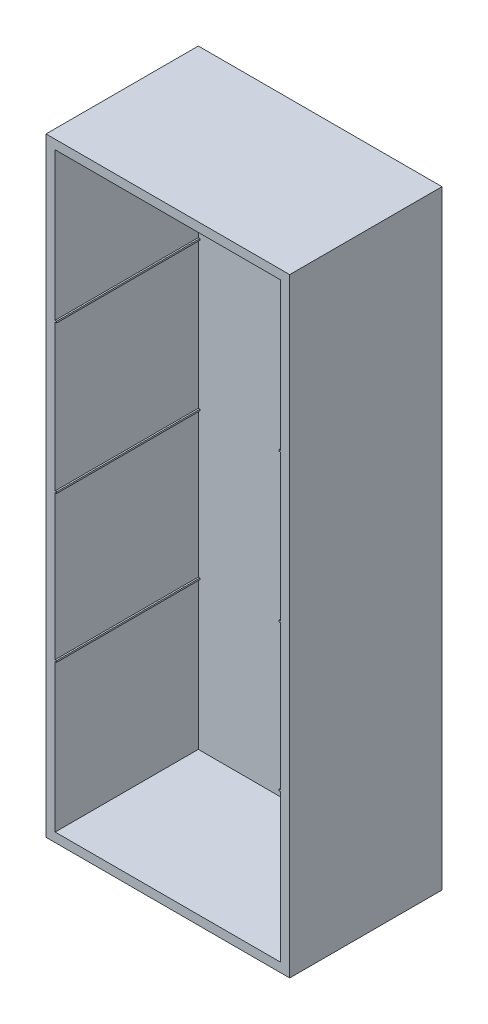
ISO-10303-21;
HEADER;
FILE_DESCRIPTION(('STEP AP214'),'2;1');
FILE_NAME('part.step','',(''),(''),'','','');
FILE_SCHEMA(('AUTOMOTIVE_DESIGN { 1 0 10303 214 1 1 1 1 }'));
ENDSEC;
DATA;
#1=APPLICATION_CONTEXT('core data for automotive mechanical design processes');
#2=APPLICATION_PROTOCOL_DEFINITION('international standard','automotive_design',2000,#1);
#3=PRODUCT_CONTEXT('',#1,'mechanical');
#4=PRODUCT('Part','Part','',(#3));
#5=PRODUCT_RELATED_PRODUCT_CATEGORY('part','',(#4));
#6=PRODUCT_DEFINITION_FORMATION('','',#4);
#7=PRODUCT_DEFINITION_CONTEXT('part definition',#1,'design');
#8=PRODUCT_DEFINITION('design','',#6,#7);
#9=PRODUCT_DEFINITION_SHAPE('','',#8);
#10=(LENGTH_UNIT() NAMED_UNIT(*) SI_UNIT(.MILLI.,.METRE.));
#11=(NAMED_UNIT(*) PLANE_ANGLE_UNIT() SI_UNIT($,.RADIAN.));
#12=(NAMED_UNIT(*) SI_UNIT($,.STERADIAN.) SOLID_ANGLE_UNIT());
#13=UNCERTAINTY_MEASURE_WITH_UNIT(LENGTH_MEASURE(1.E-05),#10,'distance_accuracy_value','');
#14=(GEOMETRIC_REPRESENTATION_CONTEXT(3) GLOBAL_UNCERTAINTY_ASSIGNED_CONTEXT((#13)) GLOBAL_UNIT_ASSIGNED_CONTEXT((#10,
#11,#12)) REPRESENTATION_CONTEXT('',''));
#15=CARTESIAN_POINT('',(0.,0.,0.));
#16=DIRECTION('',(0.,0.,1.));
#17=DIRECTION('',(1.,0.,0.));
#18=AXIS2_PLACEMENT_3D('',#15,#16,#17);
#19=CARTESIAN_POINT('',(0.,0.,30.));
#20=DIRECTION('',(0.,0.,1.));
#21=DIRECTION('',(1.,0.,0.));
#22=AXIS2_PLACEMENT_3D('',#19,#20,#21);
#23=PLANE('',#22);
#24=DIRECTION('',(0.,1.,0.));
#25=VECTOR('',#24,1.);
#26=CARTESIAN_POINT('',(-365.,-480.,30.));
#27=LINE('',#26,#25);
#28=CARTESIAN_POINT('',(-365.,-485.,30.));
#29=VERTEX_POINT('',#28);
#30=CARTESIAN_POINT('',(-365.,-480.,30.));
#31=VERTEX_POINT('',#30);
#32=EDGE_CURVE('E54',#29,#31,#27,.T.);
#33=ORIENTED_EDGE('',*,*,#32,.F.);
#34=DIRECTION('',(-1.,0.,0.));
#35=VECTOR('',#34,1.);
#36=CARTESIAN_POINT('',(-365.,-485.,30.));
#37=LINE('',#36,#35);
#38=CARTESIAN_POINT('',(-370.,-485.,30.));
#39=VERTEX_POINT('',#38);
#40=EDGE_CURVE('E249',#29,#39,#37,.T.);
#41=ORIENTED_EDGE('',*,*,#40,.T.);
#42=DIRECTION('',(0.,-1.,0.));
#43=VECTOR('',#42,1.);
#44=CARTESIAN_POINT('',(-370.,-1000.,30.));
#45=LINE('',#44,#43);
#46=CARTESIAN_POINT('',(-370.,-970.,30.));
#47=VERTEX_POINT('',#46);
#48=EDGE_CURVE('E405',#39,#47,#45,.T.);
#49=ORIENTED_EDGE('',*,*,#48,.T.);
#50=DIRECTION('',(1.,0.,0.));
#51=VECTOR('',#50,1.);
#52=CARTESIAN_POINT('',(400.,-970.,30.));
#53=LINE('',#52,#51);
#54=CARTESIAN_POINT('',(370.,-970.,30.));
#55=VERTEX_POINT('',#54);
#56=EDGE_CURVE('E409',#47,#55,#53,.T.);
#57=ORIENTED_EDGE('',*,*,#56,.T.);
#58=DIRECTION('',(0.,1.,0.));
#59=VECTOR('',#58,1.);
#60=CARTESIAN_POINT('',(370.,-1000.,30.));
#61=LINE('',#60,#59);
#62=CARTESIAN_POINT('',(370.,-485.,30.));
#63=VERTEX_POINT('',#62);
#64=EDGE_CURVE('E425',#55,#63,#61,.T.);
#65=ORIENTED_EDGE('',*,*,#64,.T.);
#66=DIRECTION('',(1.,0.,0.));
#67=VECTOR('',#66,1.);
#68=CARTESIAN_POINT('',(365.,-485.,30.));
#69=LINE('',#68,#67);
#70=CARTESIAN_POINT('',(365.,-485.,30.));
#71=VERTEX_POINT('',#70);
#72=EDGE_CURVE('E292',#71,#63,#69,.T.);
#73=ORIENTED_EDGE('',*,*,#72,.F.);
#74=DIRECTION('',(0.,-1.,0.));
#75=VECTOR('',#74,1.);
#76=CARTESIAN_POINT('',(365.,-480.,30.));
#77=LINE('',#76,#75);
#78=CARTESIAN_POINT('',(365.,-480.,30.));
#79=VERTEX_POINT('',#78);
#80=EDGE_CURVE('E282',#79,#71,#77,.T.);
#81=ORIENTED_EDGE('',*,*,#80,.F.);
#82=DIRECTION('',(1.,0.,0.));
#83=VECTOR('',#82,1.);
#84=CARTESIAN_POINT('',(365.,-480.,30.));
#85=LINE('',#84,#83);
#86=CARTESIAN_POINT('',(370.,-480.,30.));
#87=VERTEX_POINT('',#86);
#88=EDGE_CURVE('E295',#79,#87,#85,.T.);
#89=ORIENTED_EDGE('',*,*,#88,.T.);
#90=CARTESIAN_POINT('',(370.,-5.,30.));
#91=VERTEX_POINT('',#90);
#92=EDGE_CURVE('E429',#87,#91,#61,.T.);
#93=ORIENTED_EDGE('',*,*,#92,.T.);
#94=DIRECTION('',(1.,0.,0.));
#95=VECTOR('',#94,1.);
#96=CARTESIAN_POINT('',(365.,-5.00000000000006,30.));
#97=LINE('',#96,#95);
#98=CARTESIAN_POINT('',(365.,-5.00000000000006,30.));
#99=VERTEX_POINT('',#98);
#100=EDGE_CURVE('E348',#99,#91,#97,.T.);
#101=ORIENTED_EDGE('',*,*,#100,.F.);
#102=DIRECTION('',(0.,-1.,0.));
#103=VECTOR('',#102,1.);
#104=CARTESIAN_POINT('',(365.,0.,30.));
#105=LINE('',#104,#103);
#106=CARTESIAN_POINT('',(365.,0.,30.));
#107=VERTEX_POINT('',#106);
#108=EDGE_CURVE('E336',#107,#99,#105,.T.);
#109=ORIENTED_EDGE('',*,*,#108,.F.);
#110=DIRECTION('',(1.,0.,0.));
#111=VECTOR('',#110,1.);
#112=CARTESIAN_POINT('',(365.,0.,30.));
#113=LINE('',#112,#111);
#114=CARTESIAN_POINT('',(370.,0.,30.));
#115=VERTEX_POINT('',#114);
#116=EDGE_CURVE('E351',#107,#115,#113,.T.);
#117=ORIENTED_EDGE('',*,*,#116,.T.);
#118=CARTESIAN_POINT('',(370.,480.,30.));
#119=VERTEX_POINT('',#118);
#120=EDGE_CURVE('E829',#115,#119,#61,.T.);
#121=ORIENTED_EDGE('',*,*,#120,.T.);
#122=DIRECTION('',(1.,0.,0.));
#123=VECTOR('',#122,1.);
#124=CARTESIAN_POINT('',(365.,480.,30.));
#125=LINE('',#124,#123);
#126=CARTESIAN_POINT('',(365.,480.,30.));
#127=VERTEX_POINT('',#126);
#128=EDGE_CURVE('E397',#127,#119,#125,.T.);
#129=ORIENTED_EDGE('',*,*,#128,.F.);
#130=DIRECTION('',(0.,-1.,0.));
#131=VECTOR('',#130,1.);
#132=CARTESIAN_POINT('',(365.,485.,30.));
#133=LINE('',#132,#131);
#134=CARTESIAN_POINT('',(365.,485.,30.));
#135=VERTEX_POINT('',#134);
#136=EDGE_CURVE('E387',#135,#127,#133,.T.);
#137=ORIENTED_EDGE('',*,*,#136,.F.);
#138=DIRECTION('',(1.,0.,0.));
#139=VECTOR('',#138,1.);
#140=CARTESIAN_POINT('',(365.,485.,30.));
#141=LINE('',#140,#139);
#142=CARTESIAN_POINT('',(370.,485.,30.));
#143=VERTEX_POINT('',#142);
#144=EDGE_CURVE('E400',#135,#143,#141,.T.);
#145=ORIENTED_EDGE('',*,*,#144,.T.);
#146=CARTESIAN_POINT('',(370.,970.,30.));
#147=VERTEX_POINT('',#146);
#148=EDGE_CURVE('E422',#143,#147,#61,.T.);
#149=ORIENTED_EDGE('',*,*,#148,.T.);
#150=DIRECTION('',(-1.,0.,0.));
#151=VECTOR('',#150,1.);
#152=CARTESIAN_POINT('',(400.,970.,30.));
#153=LINE('',#152,#151);
#154=CARTESIAN_POINT('',(-370.,970.,30.));
#155=VERTEX_POINT('',#154);
#156=EDGE_CURVE('E428',#147,#155,#153,.T.);
#157=ORIENTED_EDGE('',*,*,#156,.T.);
#158=CARTESIAN_POINT('',(-370.,485.,30.));
#159=VERTEX_POINT('',#158);
#160=EDGE_CURVE('E406',#155,#159,#45,.T.);
#161=ORIENTED_EDGE('',*,*,#160,.T.);
#162=DIRECTION('',(-1.,0.,0.));
#163=VECTOR('',#162,1.);
#164=CARTESIAN_POINT('',(-365.,485.,30.));
#165=LINE('',#164,#163);
#166=CARTESIAN_POINT('',(-365.,485.,30.));
#167=VERTEX_POINT('',#166);
#168=EDGE_CURVE('E372',#167,#159,#165,.T.);
#169=ORIENTED_EDGE('',*,*,#168,.F.);
#170=DIRECTION('',(0.,1.,0.));
#171=VECTOR('',#170,1.);
#172=CARTESIAN_POINT('',(-365.,485.,30.));
#173=LINE('',#172,#171);
#174=CARTESIAN_POINT('',(-365.,480.,30.));
#175=VERTEX_POINT('',#174);
#176=EDGE_CURVE('E363',#175,#167,#173,.T.);
#177=ORIENTED_EDGE('',*,*,#176,.F.);
#178=DIRECTION('',(-1.,0.,0.));
#179=VECTOR('',#178,1.);
#180=CARTESIAN_POINT('',(-365.,480.,30.));
#181=LINE('',#180,#179);
#182=CARTESIAN_POINT('',(-370.,480.,30.));
#183=VERTEX_POINT('',#182);
#184=EDGE_CURVE('E374',#175,#183,#181,.T.);
#185=ORIENTED_EDGE('',*,*,#184,.T.);
#186=CARTESIAN_POINT('',(-370.,0.,30.));
#187=VERTEX_POINT('',#186);
#188=EDGE_CURVE('E410',#183,#187,#45,.T.);
#189=ORIENTED_EDGE('',*,*,#188,.T.);
#190=DIRECTION('',(-1.,0.,0.));
#191=VECTOR('',#190,1.);
#192=CARTESIAN_POINT('',(-365.,0.,30.));
#193=LINE('',#192,#191);
#194=CARTESIAN_POINT('',(-365.,0.,30.));
#195=VERTEX_POINT('',#194);
#196=EDGE_CURVE('E320',#195,#187,#193,.T.);
#197=ORIENTED_EDGE('',*,*,#196,.F.);
#198=DIRECTION('',(0.,1.,0.));
#199=VECTOR('',#198,1.);
#200=CARTESIAN_POINT('',(-365.,0.,30.));
#201=LINE('',#200,#199);
#202=CARTESIAN_POINT('',(-365.,-5.,30.));
#203=VERTEX_POINT('',#202);
#204=EDGE_CURVE('E308',#203,#195,#201,.T.);
#205=ORIENTED_EDGE('',*,*,#204,.F.);
#206=DIRECTION('',(-1.,0.,0.));
#207=VECTOR('',#206,1.);
#208=CARTESIAN_POINT('',(-365.,-5.,30.));
#209=LINE('',#208,#207);
#210=CARTESIAN_POINT('',(-370.,-5.,30.));
#211=VERTEX_POINT('',#210);
#212=EDGE_CURVE('E323',#203,#211,#209,.T.);
#213=ORIENTED_EDGE('',*,*,#212,.T.);
#214=CARTESIAN_POINT('',(-370.,-480.,30.));
#215=VERTEX_POINT('',#214);
#216=EDGE_CURVE('E862',#211,#215,#45,.T.);
#217=ORIENTED_EDGE('',*,*,#216,.T.);
#218=DIRECTION('',(-1.,0.,0.));
#219=VECTOR('',#218,1.);
#220=CARTESIAN_POINT('',(-365.,-480.,30.));
#221=LINE('',#220,#219);
#222=EDGE_CURVE('E50',#31,#215,#221,.T.);
#223=ORIENTED_EDGE('',*,*,#222,.F.);
#224=EDGE_LOOP('',(#33,#41,#49,#57,#65,#73,#81,#89,#93,#101,#109,#117,#121,#129,#137,#145,#149,
#157,#161,#169,#177,#185,#189,#197,#205,#213,#217,#223));
#225=FACE_BOUND('',#224,.T.);
#226=ADVANCED_FACE('F35',(#225),#23,.T.);
#227=CARTESIAN_POINT('',(-370.,-1000.,500.));
#228=DIRECTION('',(1.,0.,0.));
#229=DIRECTION('',(0.,0.,-1.));
#230=AXIS2_PLACEMENT_3D('',#227,#228,#229);
#231=PLANE('',#230);
#232=ORIENTED_EDGE('',*,*,#48,.F.);
#233=DIRECTION('',(0.,0.,-1.));
#234=VECTOR('',#233,1.);
#235=CARTESIAN_POINT('',(-370.,-485.,500.));
#236=LINE('',#235,#234);
#237=CARTESIAN_POINT('',(-370.,-485.,500.));
#238=VERTEX_POINT('',#237);
#239=EDGE_CURVE('E869',#238,#39,#236,.T.);
#240=ORIENTED_EDGE('',*,*,#239,.F.);
#241=DIRECTION('',(0.,-1.,0.));
#242=VECTOR('',#241,1.);
#243=CARTESIAN_POINT('',(-370.,-1000.,500.));
#244=LINE('',#243,#242);
#245=CARTESIAN_POINT('',(-370.,-970.,500.));
#246=VERTEX_POINT('',#245);
#247=EDGE_CURVE('E266',#238,#246,#244,.T.);
#248=ORIENTED_EDGE('',*,*,#247,.T.);
#249=DIRECTION('',(0.,0.,-1.));
#250=VECTOR('',#249,1.);
#251=CARTESIAN_POINT('',(-370.,-970.,500.));
#252=LINE('',#251,#250);
#253=EDGE_CURVE('E411',#246,#47,#252,.T.);
#254=ORIENTED_EDGE('',*,*,#253,.T.);
#255=EDGE_LOOP('',(#232,#240,#248,#254));
#256=FACE_BOUND('',#255,.T.);
#257=ADVANCED_FACE('F494',(#256),#231,.T.);
#258=CARTESIAN_POINT('',(-370.,-5.,500.));
#259=VERTEX_POINT('',#258);
#260=CARTESIAN_POINT('',(-370.,-480.,500.));
#261=VERTEX_POINT('',#260);
#262=EDGE_CURVE('E870',#259,#261,#244,.T.);
#263=ORIENTED_EDGE('',*,*,#262,.T.);
#264=DIRECTION('',(0.,0.,1.));
#265=VECTOR('',#264,1.);
#266=CARTESIAN_POINT('',(-370.,-480.,500.));
#267=LINE('',#266,#265);
#268=EDGE_CURVE('E260',#215,#261,#267,.T.);
#269=ORIENTED_EDGE('',*,*,#268,.F.);
#270=ORIENTED_EDGE('',*,*,#216,.F.);
#271=DIRECTION('',(0.,0.,-1.));
#272=VECTOR('',#271,1.);
#273=CARTESIAN_POINT('',(-370.,-5.,500.));
#274=LINE('',#273,#272);
#275=EDGE_CURVE('E300',#259,#211,#274,.T.);
#276=ORIENTED_EDGE('',*,*,#275,.F.);
#277=EDGE_LOOP('',(#263,#269,#270,#276));
#278=FACE_BOUND('',#277,.T.);
#279=ADVANCED_FACE('F500',(#278),#231,.T.);
#280=CARTESIAN_POINT('',(370.,-1000.,500.));
#281=DIRECTION('',(-1.,0.,0.));
#282=DIRECTION('',(0.,0.,1.));
#283=AXIS2_PLACEMENT_3D('',#280,#281,#282);
#284=PLANE('',#283);
#285=ORIENTED_EDGE('',*,*,#92,.F.);
#286=DIRECTION('',(0.,0.,-1.));
#287=VECTOR('',#286,1.);
#288=CARTESIAN_POINT('',(370.,-480.,500.));
#289=LINE('',#288,#287);
#290=CARTESIAN_POINT('',(370.,-480.,500.));
#291=VERTEX_POINT('',#290);
#292=EDGE_CURVE('E268',#291,#87,#289,.T.);
#293=ORIENTED_EDGE('',*,*,#292,.F.);
#294=DIRECTION('',(0.,1.,0.));
#295=VECTOR('',#294,1.);
#296=CARTESIAN_POINT('',(370.,-1000.,500.));
#297=LINE('',#296,#295);
#298=CARTESIAN_POINT('',(370.,-5.,500.));
#299=VERTEX_POINT('',#298);
#300=EDGE_CURVE('E442',#291,#299,#297,.T.);
#301=ORIENTED_EDGE('',*,*,#300,.T.);
#302=DIRECTION('',(0.,0.,1.));
#303=VECTOR('',#302,1.);
#304=CARTESIAN_POINT('',(370.,-5.,500.));
#305=LINE('',#304,#303);
#306=EDGE_CURVE('E333',#91,#299,#305,.T.);
#307=ORIENTED_EDGE('',*,*,#306,.F.);
#308=EDGE_LOOP('',(#285,#293,#301,#307));
#309=FACE_BOUND('',#308,.T.);
#310=ADVANCED_FACE('F646',(#309),#284,.T.);
#311=CARTESIAN_POINT('',(370.,-970.,500.));
#312=VERTEX_POINT('',#311);
#313=CARTESIAN_POINT('',(370.,-485.,500.));
#314=VERTEX_POINT('',#313);
#315=EDGE_CURVE('E440',#312,#314,#297,.T.);
#316=ORIENTED_EDGE('',*,*,#315,.T.);
#317=DIRECTION('',(0.,0.,1.));
#318=VECTOR('',#317,1.);
#319=CARTESIAN_POINT('',(370.,-485.,500.));
#320=LINE('',#319,#318);
#321=EDGE_CURVE('E271',#63,#314,#320,.T.);
#322=ORIENTED_EDGE('',*,*,#321,.F.);
#323=ORIENTED_EDGE('',*,*,#64,.F.);
#324=DIRECTION('',(0.,0.,-1.));
#325=VECTOR('',#324,1.);
#326=CARTESIAN_POINT('',(370.,-970.,500.));
#327=LINE('',#326,#325);
#328=EDGE_CURVE('E415',#312,#55,#327,.T.);
#329=ORIENTED_EDGE('',*,*,#328,.F.);
#330=EDGE_LOOP('',(#316,#322,#323,#329));
#331=FACE_BOUND('',#330,.T.);
#332=ADVANCED_FACE('F640',(#331),#284,.T.);
#333=CARTESIAN_POINT('',(-370.,480.,500.));
#334=VERTEX_POINT('',#333);
#335=CARTESIAN_POINT('',(-370.,0.,500.));
#336=VERTEX_POINT('',#335);
#337=EDGE_CURVE('E437',#334,#336,#244,.T.);
#338=ORIENTED_EDGE('',*,*,#337,.T.);
#339=DIRECTION('',(0.,0.,1.));
#340=VECTOR('',#339,1.);
#341=CARTESIAN_POINT('',(-370.,0.,500.));
#342=LINE('',#341,#340);
#343=EDGE_CURVE('E305',#187,#336,#342,.T.);
#344=ORIENTED_EDGE('',*,*,#343,.F.);
#345=ORIENTED_EDGE('',*,*,#188,.F.);
#346=DIRECTION('',(0.,0.,-1.));
#347=VECTOR('',#346,1.);
#348=CARTESIAN_POINT('',(-370.,480.,500.));
#349=LINE('',#348,#347);
#350=EDGE_CURVE('E356',#334,#183,#349,.T.);
#351=ORIENTED_EDGE('',*,*,#350,.F.);
#352=EDGE_LOOP('',(#338,#344,#345,#351));
#353=FACE_BOUND('',#352,.T.);
#354=ADVANCED_FACE('F645',(#353),#231,.T.);
#355=ORIENTED_EDGE('',*,*,#120,.F.);
#356=DIRECTION('',(0.,0.,-1.));
#357=VECTOR('',#356,1.);
#358=CARTESIAN_POINT('',(370.,0.,500.));
#359=LINE('',#358,#357);
#360=CARTESIAN_POINT('',(370.,0.,500.));
#361=VERTEX_POINT('',#360);
#362=EDGE_CURVE('E328',#361,#115,#359,.T.);
#363=ORIENTED_EDGE('',*,*,#362,.F.);
#364=CARTESIAN_POINT('',(370.,480.,500.));
#365=VERTEX_POINT('',#364);
#366=EDGE_CURVE('E843',#361,#365,#297,.T.);
#367=ORIENTED_EDGE('',*,*,#366,.T.);
#368=DIRECTION('',(0.,0.,1.));
#369=VECTOR('',#368,1.);
#370=CARTESIAN_POINT('',(370.,480.,500.));
#371=LINE('',#370,#369);
#372=EDGE_CURVE('E384',#119,#365,#371,.T.);
#373=ORIENTED_EDGE('',*,*,#372,.F.);
#374=EDGE_LOOP('',(#355,#363,#367,#373));
#375=FACE_BOUND('',#374,.T.);
#376=ADVANCED_FACE('F648',(#375),#284,.T.);
#377=CARTESIAN_POINT('',(-370.,970.,500.));
#378=VERTEX_POINT('',#377);
#379=CARTESIAN_POINT('',(-370.,485.,500.));
#380=VERTEX_POINT('',#379);
#381=EDGE_CURVE('E433',#378,#380,#244,.T.);
#382=ORIENTED_EDGE('',*,*,#381,.T.);
#383=DIRECTION('',(0.,0.,1.));
#384=VECTOR('',#383,1.);
#385=CARTESIAN_POINT('',(-370.,485.,500.));
#386=LINE('',#385,#384);
#387=EDGE_CURVE('E361',#159,#380,#386,.T.);
#388=ORIENTED_EDGE('',*,*,#387,.F.);
#389=ORIENTED_EDGE('',*,*,#160,.F.);
#390=DIRECTION('',(0.,0.,-1.));
#391=VECTOR('',#390,1.);
#392=CARTESIAN_POINT('',(-370.,970.,500.));
#393=LINE('',#392,#391);
#394=EDGE_CURVE('E416',#378,#155,#393,.T.);
#395=ORIENTED_EDGE('',*,*,#394,.F.);
#396=EDGE_LOOP('',(#382,#388,#389,#395));
#397=FACE_BOUND('',#396,.T.);
#398=ADVANCED_FACE('F503',(#397),#231,.T.);
#399=ORIENTED_EDGE('',*,*,#148,.F.);
#400=DIRECTION('',(0.,0.,-1.));
#401=VECTOR('',#400,1.);
#402=CARTESIAN_POINT('',(370.,485.,500.));
#403=LINE('',#402,#401);
#404=CARTESIAN_POINT('',(370.,485.,500.));
#405=VERTEX_POINT('',#404);
#406=EDGE_CURVE('E379',#405,#143,#403,.T.);
#407=ORIENTED_EDGE('',*,*,#406,.F.);
#408=CARTESIAN_POINT('',(370.,970.,500.));
#409=VERTEX_POINT('',#408);
#410=EDGE_CURVE('E439',#405,#409,#297,.T.);
#411=ORIENTED_EDGE('',*,*,#410,.T.);
#412=DIRECTION('',(0.,0.,-1.));
#413=VECTOR('',#412,1.);
#414=CARTESIAN_POINT('',(370.,970.,500.));
#415=LINE('',#414,#413);
#416=EDGE_CURVE('E419',#409,#147,#415,.T.);
#417=ORIENTED_EDGE('',*,*,#416,.T.);
#418=EDGE_LOOP('',(#399,#407,#411,#417));
#419=FACE_BOUND('',#418,.T.);
#420=ADVANCED_FACE('F492',(#419),#284,.T.);
#421=CARTESIAN_POINT('',(-400.,-1000.,500.));
#422=DIRECTION('',(1.,0.,0.));
#423=DIRECTION('',(0.,0.,-1.));
#424=AXIS2_PLACEMENT_3D('',#421,#422,#423);
#425=PLANE('',#424);
#426=DIRECTION('',(0.,-1.,0.));
#427=VECTOR('',#426,1.);
#428=CARTESIAN_POINT('',(-400.,-1000.,0.));
#429=LINE('',#428,#427);
#430=CARTESIAN_POINT('',(-400.,1000.,0.));
#431=VERTEX_POINT('',#430);
#432=CARTESIAN_POINT('',(-400.,-1000.,0.));
#433=VERTEX_POINT('',#432);
#434=EDGE_CURVE('E414',#431,#433,#429,.T.);
#435=ORIENTED_EDGE('',*,*,#434,.T.);
#436=DIRECTION('',(0.,0.,-1.));
#437=VECTOR('',#436,1.);
#438=CARTESIAN_POINT('',(-400.,-1000.,500.));
#439=LINE('',#438,#437);
#440=CARTESIAN_POINT('',(-400.,-1000.,500.));
#441=VERTEX_POINT('',#440);
#442=EDGE_CURVE('E11',#441,#433,#439,.T.);
#443=ORIENTED_EDGE('',*,*,#442,.F.);
#444=DIRECTION('',(0.,-1.,0.));
#445=VECTOR('',#444,1.);
#446=CARTESIAN_POINT('',(-400.,-1000.,500.));
#447=LINE('',#446,#445);
#448=CARTESIAN_POINT('',(-400.,1000.,500.));
#449=VERTEX_POINT('',#448);
#450=EDGE_CURVE('E444',#449,#441,#447,.T.);
#451=ORIENTED_EDGE('',*,*,#450,.F.);
#452=DIRECTION('',(0.,0.,-1.));
#453=VECTOR('',#452,1.);
#454=CARTESIAN_POINT('',(-400.,1000.,500.));
#455=LINE('',#454,#453);
#456=EDGE_CURVE('E454',#449,#431,#455,.T.);
#457=ORIENTED_EDGE('',*,*,#456,.T.);
#458=EDGE_LOOP('',(#435,#443,#451,#457));
#459=FACE_BOUND('',#458,.T.);
#460=ADVANCED_FACE('F37',(#459),#425,.F.);
#461=CARTESIAN_POINT('',(400.,-1000.,500.));
#462=DIRECTION('',(0.,1.,0.));
#463=DIRECTION('',(-1.,0.,0.));
#464=AXIS2_PLACEMENT_3D('',#461,#462,#463);
#465=PLANE('',#464);
#466=DIRECTION('',(1.,0.,0.));
#467=VECTOR('',#466,1.);
#468=CARTESIAN_POINT('',(400.,-1000.,0.));
#469=LINE('',#468,#467);
#470=CARTESIAN_POINT('',(400.,-1000.,0.));
#471=VERTEX_POINT('',#470);
#472=EDGE_CURVE('E457',#433,#471,#469,.T.);
#473=ORIENTED_EDGE('',*,*,#472,.T.);
#474=DIRECTION('',(0.,0.,-1.));
#475=VECTOR('',#474,1.);
#476=CARTESIAN_POINT('',(400.,-1000.,500.));
#477=LINE('',#476,#475);
#478=CARTESIAN_POINT('',(400.,-1000.,500.));
#479=VERTEX_POINT('',#478);
#480=EDGE_CURVE('E43',#479,#471,#477,.T.);
#481=ORIENTED_EDGE('',*,*,#480,.F.);
#482=DIRECTION('',(1.,0.,0.));
#483=VECTOR('',#482,1.);
#484=CARTESIAN_POINT('',(400.,-1000.,500.));
#485=LINE('',#484,#483);
#486=EDGE_CURVE('E447',#441,#479,#485,.T.);
#487=ORIENTED_EDGE('',*,*,#486,.F.);
#488=ORIENTED_EDGE('',*,*,#442,.T.);
#489=EDGE_LOOP('',(#473,#481,#487,#488));
#490=FACE_BOUND('',#489,.T.);
#491=ADVANCED_FACE('F485',(#490),#465,.F.);
#492=CARTESIAN_POINT('',(400.,-1000.,500.));
#493=DIRECTION('',(-1.,0.,0.));
#494=DIRECTION('',(0.,0.,1.));
#495=AXIS2_PLACEMENT_3D('',#492,#493,#494);
#496=PLANE('',#495);
#497=DIRECTION('',(0.,1.,0.));
#498=VECTOR('',#497,1.);
#499=CARTESIAN_POINT('',(400.,-1000.,0.));
#500=LINE('',#499,#498);
#501=CARTESIAN_POINT('',(400.,1000.,0.));
#502=VERTEX_POINT('',#501);
#503=EDGE_CURVE('E459',#471,#502,#500,.T.);
#504=ORIENTED_EDGE('',*,*,#503,.T.);
#505=DIRECTION('',(0.,0.,-1.));
#506=VECTOR('',#505,1.);
#507=CARTESIAN_POINT('',(400.,1000.,500.));
#508=LINE('',#507,#506);
#509=CARTESIAN_POINT('',(400.,1000.,500.));
#510=VERTEX_POINT('',#509);
#511=EDGE_CURVE('E464',#510,#502,#508,.T.);
#512=ORIENTED_EDGE('',*,*,#511,.F.);
#513=DIRECTION('',(0.,1.,0.));
#514=VECTOR('',#513,1.);
#515=CARTESIAN_POINT('',(400.,-1000.,500.));
#516=LINE('',#515,#514);
#517=EDGE_CURVE('E450',#479,#510,#516,.T.);
#518=ORIENTED_EDGE('',*,*,#517,.F.);
#519=ORIENTED_EDGE('',*,*,#480,.T.);
#520=EDGE_LOOP('',(#504,#512,#518,#519));
#521=FACE_BOUND('',#520,.T.);
#522=ADVANCED_FACE('F471',(#521),#496,.F.);
#523=CARTESIAN_POINT('',(400.,1000.,500.));
#524=DIRECTION('',(0.,-1.,0.));
#525=DIRECTION('',(0.,0.,-1.));
#526=AXIS2_PLACEMENT_3D('',#523,#524,#525);
#527=PLANE('',#526);
#528=DIRECTION('',(-1.,0.,0.));
#529=VECTOR('',#528,1.);
#530=CARTESIAN_POINT('',(400.,1000.,0.));
#531=LINE('',#530,#529);
#532=EDGE_CURVE('E448',#502,#431,#531,.T.);
#533=ORIENTED_EDGE('',*,*,#532,.T.);
#534=ORIENTED_EDGE('',*,*,#456,.F.);
#535=DIRECTION('',(-1.,0.,0.));
#536=VECTOR('',#535,1.);
#537=CARTESIAN_POINT('',(400.,1000.,500.));
#538=LINE('',#537,#536);
#539=EDGE_CURVE('E452',#510,#449,#538,.T.);
#540=ORIENTED_EDGE('',*,*,#539,.F.);
#541=ORIENTED_EDGE('',*,*,#511,.T.);
#542=EDGE_LOOP('',(#533,#534,#540,#541));
#543=FACE_BOUND('',#542,.T.);
#544=ADVANCED_FACE('F480',(#543),#527,.F.);
#545=CARTESIAN_POINT('',(0.,0.,500.));
#546=DIRECTION('',(0.,0.,1.));
#547=DIRECTION('',(1.,0.,0.));
#548=AXIS2_PLACEMENT_3D('',#545,#546,#547);
#549=PLANE('',#548);
#550=ORIENTED_EDGE('',*,*,#381,.F.);
#551=DIRECTION('',(-1.,0.,0.));
#552=VECTOR('',#551,1.);
#553=CARTESIAN_POINT('',(400.,970.,500.));
#554=LINE('',#553,#552);
#555=EDGE_CURVE('E420',#409,#378,#554,.T.);
#556=ORIENTED_EDGE('',*,*,#555,.F.);
#557=ORIENTED_EDGE('',*,*,#410,.F.);
#558=DIRECTION('',(1.,0.,0.));
#559=VECTOR('',#558,1.);
#560=CARTESIAN_POINT('',(365.,485.,500.));
#561=LINE('',#560,#559);
#562=CARTESIAN_POINT('',(365.,485.,500.));
#563=VERTEX_POINT('',#562);
#564=EDGE_CURVE('E403',#563,#405,#561,.T.);
#565=ORIENTED_EDGE('',*,*,#564,.F.);
#566=DIRECTION('',(0.,1.,0.));
#567=VECTOR('',#566,1.);
#568=CARTESIAN_POINT('',(365.,485.,500.));
#569=LINE('',#568,#567);
#570=CARTESIAN_POINT('',(365.,480.,500.));
#571=VERTEX_POINT('',#570);
#572=EDGE_CURVE('E380',#571,#563,#569,.T.);
#573=ORIENTED_EDGE('',*,*,#572,.F.);
#574=DIRECTION('',(1.,0.,0.));
#575=VECTOR('',#574,1.);
#576=CARTESIAN_POINT('',(365.,480.,500.));
#577=LINE('',#576,#575);
#578=EDGE_CURVE('E391',#571,#365,#577,.T.);
#579=ORIENTED_EDGE('',*,*,#578,.T.);
#580=ORIENTED_EDGE('',*,*,#366,.F.);
#581=DIRECTION('',(1.,0.,0.));
#582=VECTOR('',#581,1.);
#583=CARTESIAN_POINT('',(365.,0.,500.));
#584=LINE('',#583,#582);
#585=CARTESIAN_POINT('',(365.,0.,500.));
#586=VERTEX_POINT('',#585);
#587=EDGE_CURVE('E353',#586,#361,#584,.T.);
#588=ORIENTED_EDGE('',*,*,#587,.F.);
#589=DIRECTION('',(0.,1.,0.));
#590=VECTOR('',#589,1.);
#591=CARTESIAN_POINT('',(365.,0.,500.));
#592=LINE('',#591,#590);
#593=CARTESIAN_POINT('',(365.,-5.,500.));
#594=VERTEX_POINT('',#593);
#595=EDGE_CURVE('E329',#594,#586,#592,.T.);
#596=ORIENTED_EDGE('',*,*,#595,.F.);
#597=DIRECTION('',(1.,0.,0.));
#598=VECTOR('',#597,1.);
#599=CARTESIAN_POINT('',(365.,-5.,500.));
#600=LINE('',#599,#598);
#601=EDGE_CURVE('E341',#594,#299,#600,.T.);
#602=ORIENTED_EDGE('',*,*,#601,.T.);
#603=ORIENTED_EDGE('',*,*,#300,.F.);
#604=DIRECTION('',(1.,0.,0.));
#605=VECTOR('',#604,1.);
#606=CARTESIAN_POINT('',(365.,-480.,500.));
#607=LINE('',#606,#605);
#608=CARTESIAN_POINT('',(365.,-480.,500.));
#609=VERTEX_POINT('',#608);
#610=EDGE_CURVE('E297',#609,#291,#607,.T.);
#611=ORIENTED_EDGE('',*,*,#610,.F.);
#612=DIRECTION('',(0.,1.,0.));
#613=VECTOR('',#612,1.);
#614=CARTESIAN_POINT('',(365.,-480.,500.));
#615=LINE('',#614,#613);
#616=CARTESIAN_POINT('',(365.,-485.,500.));
#617=VERTEX_POINT('',#616);
#618=EDGE_CURVE('E276',#617,#609,#615,.T.);
#619=ORIENTED_EDGE('',*,*,#618,.F.);
#620=DIRECTION('',(1.,0.,0.));
#621=VECTOR('',#620,1.);
#622=CARTESIAN_POINT('',(365.,-485.,500.));
#623=LINE('',#622,#621);
#624=EDGE_CURVE('E286',#617,#314,#623,.T.);
#625=ORIENTED_EDGE('',*,*,#624,.T.);
#626=ORIENTED_EDGE('',*,*,#315,.F.);
#627=DIRECTION('',(1.,0.,0.));
#628=VECTOR('',#627,1.);
#629=CARTESIAN_POINT('',(400.,-970.,500.));
#630=LINE('',#629,#628);
#631=EDGE_CURVE('E436',#246,#312,#630,.T.);
#632=ORIENTED_EDGE('',*,*,#631,.F.);
#633=ORIENTED_EDGE('',*,*,#247,.F.);
#634=DIRECTION('',(-1.,0.,0.));
#635=VECTOR('',#634,1.);
#636=CARTESIAN_POINT('',(-365.,-485.,500.));
#637=LINE('',#636,#635);
#638=CARTESIAN_POINT('',(-365.,-485.,500.));
#639=VERTEX_POINT('',#638);
#640=EDGE_CURVE('E248',#639,#238,#637,.T.);
#641=ORIENTED_EDGE('',*,*,#640,.F.);
#642=DIRECTION('',(0.,-1.,0.));
#643=VECTOR('',#642,1.);
#644=CARTESIAN_POINT('',(-365.,-480.,500.));
#645=LINE('',#644,#643);
#646=CARTESIAN_POINT('',(-365.,-480.,500.));
#647=VERTEX_POINT('',#646);
#648=EDGE_CURVE('E251',#647,#639,#645,.T.);
#649=ORIENTED_EDGE('',*,*,#648,.F.);
#650=DIRECTION('',(-1.,0.,0.));
#651=VECTOR('',#650,1.);
#652=CARTESIAN_POINT('',(-365.,-480.,500.));
#653=LINE('',#652,#651);
#654=EDGE_CURVE('E882',#647,#261,#653,.T.);
#655=ORIENTED_EDGE('',*,*,#654,.T.);
#656=ORIENTED_EDGE('',*,*,#262,.F.);
#657=DIRECTION('',(-1.,0.,0.));
#658=VECTOR('',#657,1.);
#659=CARTESIAN_POINT('',(-365.,-5.,500.));
#660=LINE('',#659,#658);
#661=CARTESIAN_POINT('',(-365.,-5.,500.));
#662=VERTEX_POINT('',#661);
#663=EDGE_CURVE('E325',#662,#259,#660,.T.);
#664=ORIENTED_EDGE('',*,*,#663,.F.);
#665=DIRECTION('',(0.,-1.,0.));
#666=VECTOR('',#665,1.);
#667=CARTESIAN_POINT('',(-365.,0.,500.));
#668=LINE('',#667,#666);
#669=CARTESIAN_POINT('',(-365.,0.,500.));
#670=VERTEX_POINT('',#669);
#671=EDGE_CURVE('E301',#670,#662,#668,.T.);
#672=ORIENTED_EDGE('',*,*,#671,.F.);
#673=DIRECTION('',(-1.,0.,0.));
#674=VECTOR('',#673,1.);
#675=CARTESIAN_POINT('',(-365.,0.,500.));
#676=LINE('',#675,#674);
#677=EDGE_CURVE('E313',#670,#336,#676,.T.);
#678=ORIENTED_EDGE('',*,*,#677,.T.);
#679=ORIENTED_EDGE('',*,*,#337,.F.);
#680=DIRECTION('',(-1.,0.,0.));
#681=VECTOR('',#680,1.);
#682=CARTESIAN_POINT('',(-365.,480.,500.));
#683=LINE('',#682,#681);
#684=CARTESIAN_POINT('',(-365.,480.,500.));
#685=VERTEX_POINT('',#684);
#686=EDGE_CURVE('E377',#685,#334,#683,.T.);
#687=ORIENTED_EDGE('',*,*,#686,.F.);
#688=DIRECTION('',(0.,-1.,0.));
#689=VECTOR('',#688,1.);
#690=CARTESIAN_POINT('',(-365.,485.,500.));
#691=LINE('',#690,#689);
#692=CARTESIAN_POINT('',(-365.,485.,500.));
#693=VERTEX_POINT('',#692);
#694=EDGE_CURVE('E357',#693,#685,#691,.T.);
#695=ORIENTED_EDGE('',*,*,#694,.F.);
#696=DIRECTION('',(-1.,0.,0.));
#697=VECTOR('',#696,1.);
#698=CARTESIAN_POINT('',(-365.,485.,500.));
#699=LINE('',#698,#697);
#700=EDGE_CURVE('E367',#693,#380,#699,.T.);
#701=ORIENTED_EDGE('',*,*,#700,.T.);
#702=EDGE_LOOP('',(#550,#556,#557,#565,#573,#579,#580,#588,#596,#602,#603,#611,#619,#625,#626,
#632,#633,#641,#649,#655,#656,#664,#672,#678,#679,#687,#695,#701));
#703=FACE_BOUND('',#702,.T.);
#704=ORIENTED_EDGE('',*,*,#450,.T.);
#705=ORIENTED_EDGE('',*,*,#486,.T.);
#706=ORIENTED_EDGE('',*,*,#517,.T.);
#707=ORIENTED_EDGE('',*,*,#539,.T.);
#708=EDGE_LOOP('',(#704,#705,#706,#707));
#709=FACE_BOUND('',#708,.T.);
#710=ADVANCED_FACE('F263',(#703,#709),#549,.T.);
#711=CARTESIAN_POINT('',(0.,0.,0.));
#712=DIRECTION('',(0.,0.,1.));
#713=DIRECTION('',(1.,0.,0.));
#714=AXIS2_PLACEMENT_3D('',#711,#712,#713);
#715=PLANE('',#714);
#716=ORIENTED_EDGE('',*,*,#434,.F.);
#717=ORIENTED_EDGE('',*,*,#532,.F.);
#718=ORIENTED_EDGE('',*,*,#503,.F.);
#719=ORIENTED_EDGE('',*,*,#472,.F.);
#720=EDGE_LOOP('',(#716,#717,#718,#719));
#721=FACE_BOUND('',#720,.T.);
#722=ADVANCED_FACE('F477',(#721),#715,.F.);
#723=CARTESIAN_POINT('',(400.,-970.,500.));
#724=DIRECTION('',(0.,1.,0.));
#725=DIRECTION('',(-1.,0.,0.));
#726=AXIS2_PLACEMENT_3D('',#723,#724,#725);
#727=PLANE('',#726);
#728=ORIENTED_EDGE('',*,*,#56,.F.);
#729=ORIENTED_EDGE('',*,*,#253,.F.);
#730=ORIENTED_EDGE('',*,*,#631,.T.);
#731=ORIENTED_EDGE('',*,*,#328,.T.);
#732=EDGE_LOOP('',(#728,#729,#730,#731));
#733=FACE_BOUND('',#732,.T.);
#734=ADVANCED_FACE('F512',(#733),#727,.T.);
#735=CARTESIAN_POINT('',(400.,970.,500.));
#736=DIRECTION('',(0.,-1.,0.));
#737=DIRECTION('',(0.,0.,-1.));
#738=AXIS2_PLACEMENT_3D('',#735,#736,#737);
#739=PLANE('',#738);
#740=ORIENTED_EDGE('',*,*,#156,.F.);
#741=ORIENTED_EDGE('',*,*,#416,.F.);
#742=ORIENTED_EDGE('',*,*,#555,.T.);
#743=ORIENTED_EDGE('',*,*,#394,.T.);
#744=EDGE_LOOP('',(#740,#741,#742,#743));
#745=FACE_BOUND('',#744,.T.);
#746=ADVANCED_FACE('F506',(#745),#739,.T.);
#747=CARTESIAN_POINT('',(365.,485.,500.));
#748=DIRECTION('',(0.,-1.,0.));
#749=DIRECTION('',(0.,0.,-1.));
#750=AXIS2_PLACEMENT_3D('',#747,#748,#749);
#751=PLANE('',#750);
#752=ORIENTED_EDGE('',*,*,#406,.T.);
#753=ORIENTED_EDGE('',*,*,#144,.F.);
#754=DIRECTION('',(0.,0.,-1.));
#755=VECTOR('',#754,1.);
#756=CARTESIAN_POINT('',(365.,485.,500.));
#757=LINE('',#756,#755);
#758=EDGE_CURVE('E383',#563,#135,#757,.T.);
#759=ORIENTED_EDGE('',*,*,#758,.F.);
#760=ORIENTED_EDGE('',*,*,#564,.T.);
#761=EDGE_LOOP('',(#752,#753,#759,#760));
#762=FACE_BOUND('',#761,.T.);
#763=ADVANCED_FACE('F535',(#762),#751,.F.);
#764=CARTESIAN_POINT('',(365.,480.,500.));
#765=DIRECTION('',(0.,1.,0.));
#766=DIRECTION('',(0.,0.,1.));
#767=AXIS2_PLACEMENT_3D('',#764,#765,#766);
#768=PLANE('',#767);
#769=ORIENTED_EDGE('',*,*,#372,.T.);
#770=ORIENTED_EDGE('',*,*,#578,.F.);
#771=DIRECTION('',(0.,0.,1.));
#772=VECTOR('',#771,1.);
#773=CARTESIAN_POINT('',(365.,480.,500.));
#774=LINE('',#773,#772);
#775=EDGE_CURVE('E389',#127,#571,#774,.T.);
#776=ORIENTED_EDGE('',*,*,#775,.F.);
#777=ORIENTED_EDGE('',*,*,#128,.T.);
#778=EDGE_LOOP('',(#769,#770,#776,#777));
#779=FACE_BOUND('',#778,.T.);
#780=ADVANCED_FACE('F543',(#779),#768,.F.);
#781=CARTESIAN_POINT('',(365.,0.,0.));
#782=DIRECTION('',(1.,0.,0.));
#783=DIRECTION('',(0.,0.,-1.));
#784=AXIS2_PLACEMENT_3D('',#781,#782,#783);
#785=PLANE('',#784);
#786=ORIENTED_EDGE('',*,*,#572,.T.);
#787=ORIENTED_EDGE('',*,*,#758,.T.);
#788=ORIENTED_EDGE('',*,*,#136,.T.);
#789=ORIENTED_EDGE('',*,*,#775,.T.);
#790=EDGE_LOOP('',(#786,#787,#788,#789));
#791=FACE_BOUND('',#790,.T.);
#792=ADVANCED_FACE('F551',(#791),#785,.F.);
#793=CARTESIAN_POINT('',(-365.,480.,500.));
#794=DIRECTION('',(0.,1.,0.));
#795=DIRECTION('',(0.,0.,1.));
#796=AXIS2_PLACEMENT_3D('',#793,#794,#795);
#797=PLANE('',#796);
#798=ORIENTED_EDGE('',*,*,#350,.T.);
#799=ORIENTED_EDGE('',*,*,#184,.F.);
#800=DIRECTION('',(0.,0.,-1.));
#801=VECTOR('',#800,1.);
#802=CARTESIAN_POINT('',(-365.,480.,500.));
#803=LINE('',#802,#801);
#804=EDGE_CURVE('E360',#685,#175,#803,.T.);
#805=ORIENTED_EDGE('',*,*,#804,.F.);
#806=ORIENTED_EDGE('',*,*,#686,.T.);
#807=EDGE_LOOP('',(#798,#799,#805,#806));
#808=FACE_BOUND('',#807,.T.);
#809=ADVANCED_FACE('F559',(#808),#797,.F.);
#810=CARTESIAN_POINT('',(-365.,485.,500.));
#811=DIRECTION('',(0.,-1.,0.));
#812=DIRECTION('',(0.,0.,-1.));
#813=AXIS2_PLACEMENT_3D('',#810,#811,#812);
#814=PLANE('',#813);
#815=ORIENTED_EDGE('',*,*,#387,.T.);
#816=ORIENTED_EDGE('',*,*,#700,.F.);
#817=DIRECTION('',(0.,0.,1.));
#818=VECTOR('',#817,1.);
#819=CARTESIAN_POINT('',(-365.,485.,500.));
#820=LINE('',#819,#818);
#821=EDGE_CURVE('E365',#167,#693,#820,.T.);
#822=ORIENTED_EDGE('',*,*,#821,.F.);
#823=ORIENTED_EDGE('',*,*,#168,.T.);
#824=EDGE_LOOP('',(#815,#816,#822,#823));
#825=FACE_BOUND('',#824,.T.);
#826=ADVANCED_FACE('F568',(#825),#814,.F.);
#827=CARTESIAN_POINT('',(-365.,0.,0.));
#828=DIRECTION('',(1.,0.,0.));
#829=DIRECTION('',(0.,0.,-1.));
#830=AXIS2_PLACEMENT_3D('',#827,#828,#829);
#831=PLANE('',#830);
#832=ORIENTED_EDGE('',*,*,#694,.T.);
#833=ORIENTED_EDGE('',*,*,#804,.T.);
#834=ORIENTED_EDGE('',*,*,#176,.T.);
#835=ORIENTED_EDGE('',*,*,#821,.T.);
#836=EDGE_LOOP('',(#832,#833,#834,#835));
#837=FACE_BOUND('',#836,.T.);
#838=ADVANCED_FACE('F576',(#837),#831,.T.);
#839=CARTESIAN_POINT('',(365.,0.,500.));
#840=DIRECTION('',(0.,-1.,0.));
#841=DIRECTION('',(0.,0.,-1.));
#842=AXIS2_PLACEMENT_3D('',#839,#840,#841);
#843=PLANE('',#842);
#844=ORIENTED_EDGE('',*,*,#362,.T.);
#845=ORIENTED_EDGE('',*,*,#116,.F.);
#846=DIRECTION('',(0.,0.,-1.));
#847=VECTOR('',#846,1.);
#848=CARTESIAN_POINT('',(365.,0.,500.));
#849=LINE('',#848,#847);
#850=EDGE_CURVE('E332',#586,#107,#849,.T.);
#851=ORIENTED_EDGE('',*,*,#850,.F.);
#852=ORIENTED_EDGE('',*,*,#587,.T.);
#853=EDGE_LOOP('',(#844,#845,#851,#852));
#854=FACE_BOUND('',#853,.T.);
#855=ADVANCED_FACE('F584',(#854),#843,.F.);
#856=CARTESIAN_POINT('',(365.,-5.,500.));
#857=DIRECTION('',(0.,1.,0.));
#858=DIRECTION('',(0.,0.,1.));
#859=AXIS2_PLACEMENT_3D('',#856,#857,#858);
#860=PLANE('',#859);
#861=ORIENTED_EDGE('',*,*,#306,.T.);
#862=ORIENTED_EDGE('',*,*,#601,.F.);
#863=DIRECTION('',(0.,0.,1.));
#864=VECTOR('',#863,1.);
#865=CARTESIAN_POINT('',(365.,-5.,500.));
#866=LINE('',#865,#864);
#867=EDGE_CURVE('E339',#99,#594,#866,.T.);
#868=ORIENTED_EDGE('',*,*,#867,.F.);
#869=ORIENTED_EDGE('',*,*,#100,.T.);
#870=EDGE_LOOP('',(#861,#862,#868,#869));
#871=FACE_BOUND('',#870,.T.);
#872=ADVANCED_FACE('F593',(#871),#860,.F.);
#873=CARTESIAN_POINT('',(365.,0.,0.));
#874=DIRECTION('',(1.,0.,0.));
#875=DIRECTION('',(0.,0.,-1.));
#876=AXIS2_PLACEMENT_3D('',#873,#874,#875);
#877=PLANE('',#876);
#878=ORIENTED_EDGE('',*,*,#595,.T.);
#879=ORIENTED_EDGE('',*,*,#850,.T.);
#880=ORIENTED_EDGE('',*,*,#108,.T.);
#881=ORIENTED_EDGE('',*,*,#867,.T.);
#882=EDGE_LOOP('',(#878,#879,#880,#881));
#883=FACE_BOUND('',#882,.T.);
#884=ADVANCED_FACE('F601',(#883),#877,.F.);
#885=CARTESIAN_POINT('',(-365.,-5.,500.));
#886=DIRECTION('',(0.,1.,0.));
#887=DIRECTION('',(0.,0.,1.));
#888=AXIS2_PLACEMENT_3D('',#885,#886,#887);
#889=PLANE('',#888);
#890=ORIENTED_EDGE('',*,*,#275,.T.);
#891=ORIENTED_EDGE('',*,*,#212,.F.);
#892=DIRECTION('',(0.,0.,-1.));
#893=VECTOR('',#892,1.);
#894=CARTESIAN_POINT('',(-365.,-5.,500.));
#895=LINE('',#894,#893);
#896=EDGE_CURVE('E304',#662,#203,#895,.T.);
#897=ORIENTED_EDGE('',*,*,#896,.F.);
#898=ORIENTED_EDGE('',*,*,#663,.T.);
#899=EDGE_LOOP('',(#890,#891,#897,#898));
#900=FACE_BOUND('',#899,.T.);
#901=ADVANCED_FACE('F609',(#900),#889,.F.);
#902=CARTESIAN_POINT('',(-365.,0.,500.));
#903=DIRECTION('',(0.,-1.,0.));
#904=DIRECTION('',(0.,0.,-1.));
#905=AXIS2_PLACEMENT_3D('',#902,#903,#904);
#906=PLANE('',#905);
#907=ORIENTED_EDGE('',*,*,#343,.T.);
#908=ORIENTED_EDGE('',*,*,#677,.F.);
#909=DIRECTION('',(0.,0.,1.));
#910=VECTOR('',#909,1.);
#911=CARTESIAN_POINT('',(-365.,0.,500.));
#912=LINE('',#911,#910);
#913=EDGE_CURVE('E311',#195,#670,#912,.T.);
#914=ORIENTED_EDGE('',*,*,#913,.F.);
#915=ORIENTED_EDGE('',*,*,#196,.T.);
#916=EDGE_LOOP('',(#907,#908,#914,#915));
#917=FACE_BOUND('',#916,.T.);
#918=ADVANCED_FACE('F618',(#917),#906,.F.);
#919=CARTESIAN_POINT('',(-365.,0.,0.));
#920=DIRECTION('',(1.,0.,0.));
#921=DIRECTION('',(0.,0.,-1.));
#922=AXIS2_PLACEMENT_3D('',#919,#920,#921);
#923=PLANE('',#922);
#924=ORIENTED_EDGE('',*,*,#671,.T.);
#925=ORIENTED_EDGE('',*,*,#896,.T.);
#926=ORIENTED_EDGE('',*,*,#204,.T.);
#927=ORIENTED_EDGE('',*,*,#913,.T.);
#928=EDGE_LOOP('',(#924,#925,#926,#927));
#929=FACE_BOUND('',#928,.T.);
#930=ADVANCED_FACE('F626',(#929),#923,.T.);
#931=CARTESIAN_POINT('',(365.,-480.,500.));
#932=DIRECTION('',(0.,-1.,0.));
#933=DIRECTION('',(0.,0.,-1.));
#934=AXIS2_PLACEMENT_3D('',#931,#932,#933);
#935=PLANE('',#934);
#936=ORIENTED_EDGE('',*,*,#292,.T.);
#937=ORIENTED_EDGE('',*,*,#88,.F.);
#938=DIRECTION('',(0.,0.,-1.));
#939=VECTOR('',#938,1.);
#940=CARTESIAN_POINT('',(365.,-480.,500.));
#941=LINE('',#940,#939);
#942=EDGE_CURVE('E279',#609,#79,#941,.T.);
#943=ORIENTED_EDGE('',*,*,#942,.F.);
#944=ORIENTED_EDGE('',*,*,#610,.T.);
#945=EDGE_LOOP('',(#936,#937,#943,#944));
#946=FACE_BOUND('',#945,.T.);
#947=ADVANCED_FACE('F634',(#946),#935,.F.);
#948=CARTESIAN_POINT('',(365.,-485.,500.));
#949=DIRECTION('',(0.,1.,0.));
#950=DIRECTION('',(0.,0.,1.));
#951=AXIS2_PLACEMENT_3D('',#948,#949,#950);
#952=PLANE('',#951);
#953=ORIENTED_EDGE('',*,*,#321,.T.);
#954=ORIENTED_EDGE('',*,*,#624,.F.);
#955=DIRECTION('',(0.,0.,1.));
#956=VECTOR('',#955,1.);
#957=CARTESIAN_POINT('',(365.,-485.,500.));
#958=LINE('',#957,#956);
#959=EDGE_CURVE('E285',#71,#617,#958,.T.);
#960=ORIENTED_EDGE('',*,*,#959,.F.);
#961=ORIENTED_EDGE('',*,*,#72,.T.);
#962=EDGE_LOOP('',(#953,#954,#960,#961));
#963=FACE_BOUND('',#962,.T.);
#964=ADVANCED_FACE('F683',(#963),#952,.F.);
#965=CARTESIAN_POINT('',(365.,0.,0.));
#966=DIRECTION('',(1.,0.,0.));
#967=DIRECTION('',(0.,0.,-1.));
#968=AXIS2_PLACEMENT_3D('',#965,#966,#967);
#969=PLANE('',#968);
#970=ORIENTED_EDGE('',*,*,#618,.T.);
#971=ORIENTED_EDGE('',*,*,#942,.T.);
#972=ORIENTED_EDGE('',*,*,#80,.T.);
#973=ORIENTED_EDGE('',*,*,#959,.T.);
#974=EDGE_LOOP('',(#970,#971,#972,#973));
#975=FACE_BOUND('',#974,.T.);
#976=ADVANCED_FACE('F691',(#975),#969,.F.);
#977=CARTESIAN_POINT('',(-365.,-485.,500.));
#978=DIRECTION('',(0.,1.,0.));
#979=DIRECTION('',(0.,0.,1.));
#980=AXIS2_PLACEMENT_3D('',#977,#978,#979);
#981=PLANE('',#980);
#982=ORIENTED_EDGE('',*,*,#239,.T.);
#983=ORIENTED_EDGE('',*,*,#40,.F.);
#984=DIRECTION('',(0.,0.,-1.));
#985=VECTOR('',#984,1.);
#986=CARTESIAN_POINT('',(-365.,-485.,500.));
#987=LINE('',#986,#985);
#988=EDGE_CURVE('E243',#639,#29,#987,.T.);
#989=ORIENTED_EDGE('',*,*,#988,.F.);
#990=ORIENTED_EDGE('',*,*,#640,.T.);
#991=EDGE_LOOP('',(#982,#983,#989,#990));
#992=FACE_BOUND('',#991,.T.);
#993=ADVANCED_FACE('F246',(#992),#981,.F.);
#994=CARTESIAN_POINT('',(-365.,-480.,500.));
#995=DIRECTION('',(0.,-1.,0.));
#996=DIRECTION('',(0.,0.,-1.));
#997=AXIS2_PLACEMENT_3D('',#994,#995,#996);
#998=PLANE('',#997);
#999=ORIENTED_EDGE('',*,*,#268,.T.);
#1000=ORIENTED_EDGE('',*,*,#654,.F.);
#1001=DIRECTION('',(0.,0.,1.));
#1002=VECTOR('',#1001,1.);
#1003=CARTESIAN_POINT('',(-365.,-480.,500.));
#1004=LINE('',#1003,#1002);
#1005=EDGE_CURVE('E256',#31,#647,#1004,.T.);
#1006=ORIENTED_EDGE('',*,*,#1005,.F.);
#1007=ORIENTED_EDGE('',*,*,#222,.T.);
#1008=EDGE_LOOP('',(#999,#1000,#1006,#1007));
#1009=FACE_BOUND('',#1008,.T.);
#1010=ADVANCED_FACE('F703',(#1009),#998,.F.);
#1011=CARTESIAN_POINT('',(-365.,0.,0.));
#1012=DIRECTION('',(1.,0.,0.));
#1013=DIRECTION('',(0.,0.,-1.));
#1014=AXIS2_PLACEMENT_3D('',#1011,#1012,#1013);
#1015=PLANE('',#1014);
#1016=ORIENTED_EDGE('',*,*,#648,.T.);
#1017=ORIENTED_EDGE('',*,*,#988,.T.);
#1018=ORIENTED_EDGE('',*,*,#32,.T.);
#1019=ORIENTED_EDGE('',*,*,#1005,.T.);
#1020=EDGE_LOOP('',(#1016,#1017,#1018,#1019));
#1021=FACE_BOUND('',#1020,.T.);
#1022=ADVANCED_FACE('F254',(#1021),#1015,.T.);
#1023=CLOSED_SHELL('',(#226,#257,#279,#310,#332,#354,#376,#398,#420,#460,#491,#522,#544,#710,
#722,#734,#746,#763,#780,#792,#809,#826,#838,#855,#872,#884,#901,#918,#930,#947,#964,#976,#993,
#1010,#1022));
#1024=MANIFOLD_SOLID_BREP('B2',#1023);
#1025=ADVANCED_BREP_SHAPE_REPRESENTATION('',(#18,#1024),#14);
#1026=SHAPE_DEFINITION_REPRESENTATION(#9,#1025);
ENDSEC;
END-ISO-10303-21;
